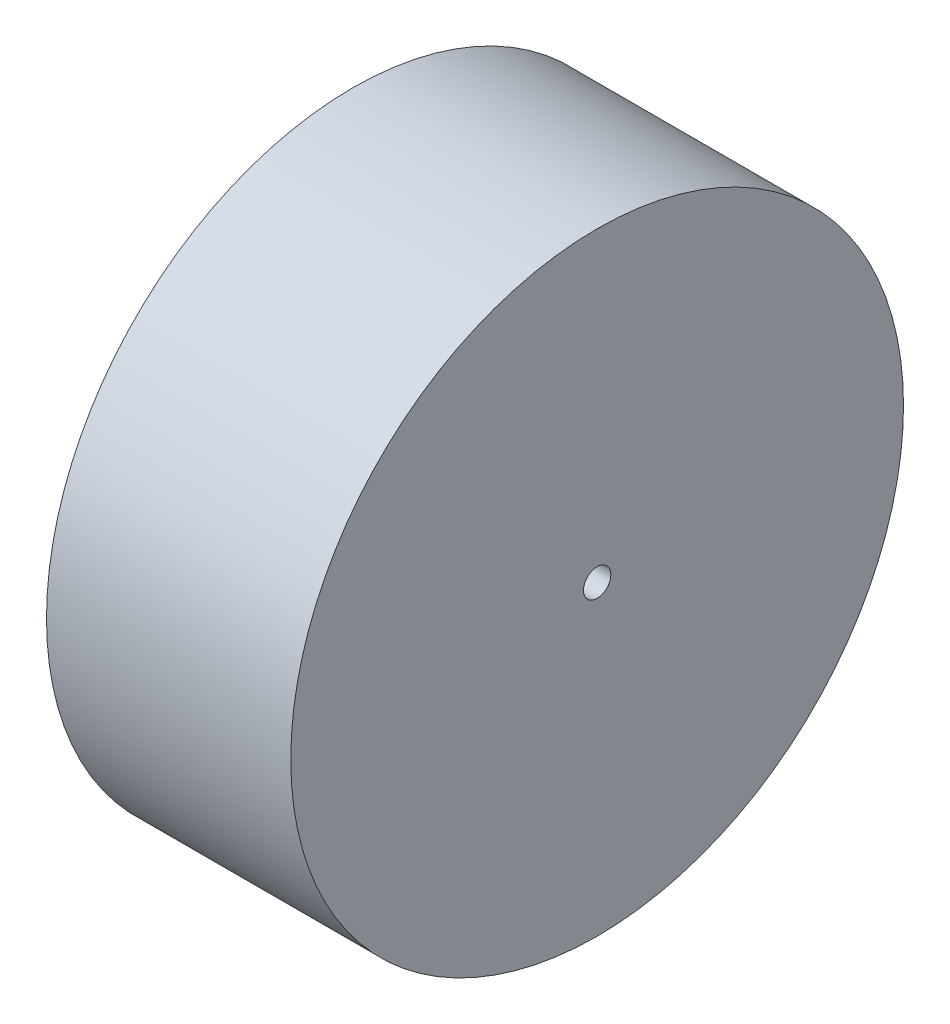
ISO-10303-21;
HEADER;
FILE_DESCRIPTION(('STEP AP214'),'2;1');
FILE_NAME('part.step','',(''),(''),'','','');
FILE_SCHEMA(('AUTOMOTIVE_DESIGN { 1 0 10303 214 1 1 1 1 }'));
ENDSEC;
DATA;
#1=APPLICATION_CONTEXT('core data for automotive mechanical design processes');
#2=APPLICATION_PROTOCOL_DEFINITION('international standard','automotive_design',2000,#1);
#3=PRODUCT_CONTEXT('',#1,'mechanical');
#4=PRODUCT('Part','Part','',(#3));
#5=PRODUCT_RELATED_PRODUCT_CATEGORY('part','',(#4));
#6=PRODUCT_DEFINITION_FORMATION('','',#4);
#7=PRODUCT_DEFINITION_CONTEXT('part definition',#1,'design');
#8=PRODUCT_DEFINITION('design','',#6,#7);
#9=PRODUCT_DEFINITION_SHAPE('','',#8);
#10=(LENGTH_UNIT() NAMED_UNIT(*) SI_UNIT(.MILLI.,.METRE.));
#11=(NAMED_UNIT(*) PLANE_ANGLE_UNIT() SI_UNIT($,.RADIAN.));
#12=(NAMED_UNIT(*) SI_UNIT($,.STERADIAN.) SOLID_ANGLE_UNIT());
#13=UNCERTAINTY_MEASURE_WITH_UNIT(LENGTH_MEASURE(1.E-05),#10,'distance_accuracy_value','');
#14=(GEOMETRIC_REPRESENTATION_CONTEXT(3) GLOBAL_UNCERTAINTY_ASSIGNED_CONTEXT((#13)) GLOBAL_UNIT_ASSIGNED_CONTEXT((#10,
#11,#12)) REPRESENTATION_CONTEXT('',''));
#15=CARTESIAN_POINT('',(0.,0.,0.));
#16=DIRECTION('',(0.,0.,1.));
#17=DIRECTION('',(1.,0.,0.));
#18=AXIS2_PLACEMENT_3D('',#15,#16,#17);
#19=CARTESIAN_POINT('',(-13.05,0.,0.));
#20=DIRECTION('',(1.,0.,0.));
#21=DIRECTION('',(0.,0.,-1.));
#22=AXIS2_PLACEMENT_3D('',#19,#20,#21);
#23=CYLINDRICAL_SURFACE('',#22,32.735);
#24=CARTESIAN_POINT('',(-13.05,0.,0.));
#25=DIRECTION('',(1.,0.,0.));
#26=DIRECTION('',(0.,0.,-1.));
#27=AXIS2_PLACEMENT_3D('',#24,#25,#26);
#28=CIRCLE('',#27,32.735);
#29=CARTESIAN_POINT('',(-13.05,0.,-32.735));
#30=VERTEX_POINT('',#29);
#31=EDGE_CURVE('E10',#30,#30,#28,.T.);
#32=ORIENTED_EDGE('',*,*,#31,.T.);
#33=EDGE_LOOP('',(#32));
#34=FACE_BOUND('',#33,.T.);
#35=CARTESIAN_POINT('',(13.05,0.,0.));
#36=DIRECTION('',(1.,0.,0.));
#37=DIRECTION('',(0.,0.,-1.));
#38=AXIS2_PLACEMENT_3D('',#35,#36,#37);
#39=CIRCLE('',#38,32.735);
#40=CARTESIAN_POINT('',(13.05,0.,-32.735));
#41=VERTEX_POINT('',#40);
#42=EDGE_CURVE('E42',#41,#41,#39,.T.);
#43=ORIENTED_EDGE('',*,*,#42,.F.);
#44=EDGE_LOOP('',(#43));
#45=FACE_BOUND('',#44,.T.);
#46=ADVANCED_FACE('F32',(#34,#45),#23,.T.);
#47=CARTESIAN_POINT('',(-13.05,0.,0.));
#48=DIRECTION('',(1.,0.,0.));
#49=DIRECTION('',(0.,0.,-1.));
#50=AXIS2_PLACEMENT_3D('',#47,#48,#49);
#51=PLANE('',#50);
#52=CARTESIAN_POINT('',(-13.05,0.,0.));
#53=DIRECTION('',(1.,0.,0.));
#54=DIRECTION('',(0.,0.,-1.));
#55=AXIS2_PLACEMENT_3D('',#52,#53,#54);
#56=CIRCLE('',#55,1.46);
#57=CARTESIAN_POINT('',(-13.05,0.,-1.46));
#58=VERTEX_POINT('',#57);
#59=EDGE_CURVE('E38',#58,#58,#56,.T.);
#60=ORIENTED_EDGE('',*,*,#59,.T.);
#61=EDGE_LOOP('',(#60));
#62=FACE_BOUND('',#61,.T.);
#63=ORIENTED_EDGE('',*,*,#31,.F.);
#64=EDGE_LOOP('',(#63));
#65=FACE_BOUND('',#64,.T.);
#66=ADVANCED_FACE('F61',(#62,#65),#51,.F.);
#67=CARTESIAN_POINT('',(-13.05,0.,0.));
#68=DIRECTION('',(1.,0.,0.));
#69=DIRECTION('',(0.,0.,-1.));
#70=AXIS2_PLACEMENT_3D('',#67,#68,#69);
#71=CYLINDRICAL_SURFACE('',#70,1.46);
#72=ORIENTED_EDGE('',*,*,#59,.F.);
#73=EDGE_LOOP('',(#72));
#74=FACE_BOUND('',#73,.T.);
#75=CARTESIAN_POINT('',(13.05,0.,0.));
#76=DIRECTION('',(1.,0.,0.));
#77=DIRECTION('',(0.,0.,-1.));
#78=AXIS2_PLACEMENT_3D('',#75,#76,#77);
#79=CIRCLE('',#78,1.46);
#80=CARTESIAN_POINT('',(13.05,0.,-1.46));
#81=VERTEX_POINT('',#80);
#82=EDGE_CURVE('E46',#81,#81,#79,.T.);
#83=ORIENTED_EDGE('',*,*,#82,.T.);
#84=EDGE_LOOP('',(#83));
#85=FACE_BOUND('',#84,.T.);
#86=ADVANCED_FACE('F52',(#74,#85),#71,.F.);
#87=CARTESIAN_POINT('',(13.05,0.,0.));
#88=DIRECTION('',(1.,0.,0.));
#89=DIRECTION('',(0.,0.,-1.));
#90=AXIS2_PLACEMENT_3D('',#87,#88,#89);
#91=PLANE('',#90);
#92=ORIENTED_EDGE('',*,*,#42,.T.);
#93=EDGE_LOOP('',(#92));
#94=FACE_BOUND('',#93,.T.);
#95=ORIENTED_EDGE('',*,*,#82,.F.);
#96=EDGE_LOOP('',(#95));
#97=FACE_BOUND('',#96,.T.);
#98=ADVANCED_FACE('F54',(#94,#97),#91,.T.);
#99=CLOSED_SHELL('',(#46,#66,#86,#98));
#100=MANIFOLD_SOLID_BREP('B2',#99);
#101=ADVANCED_BREP_SHAPE_REPRESENTATION('',(#18,#100),#14);
#102=SHAPE_DEFINITION_REPRESENTATION(#9,#101);
ENDSEC;
END-ISO-10303-21;
